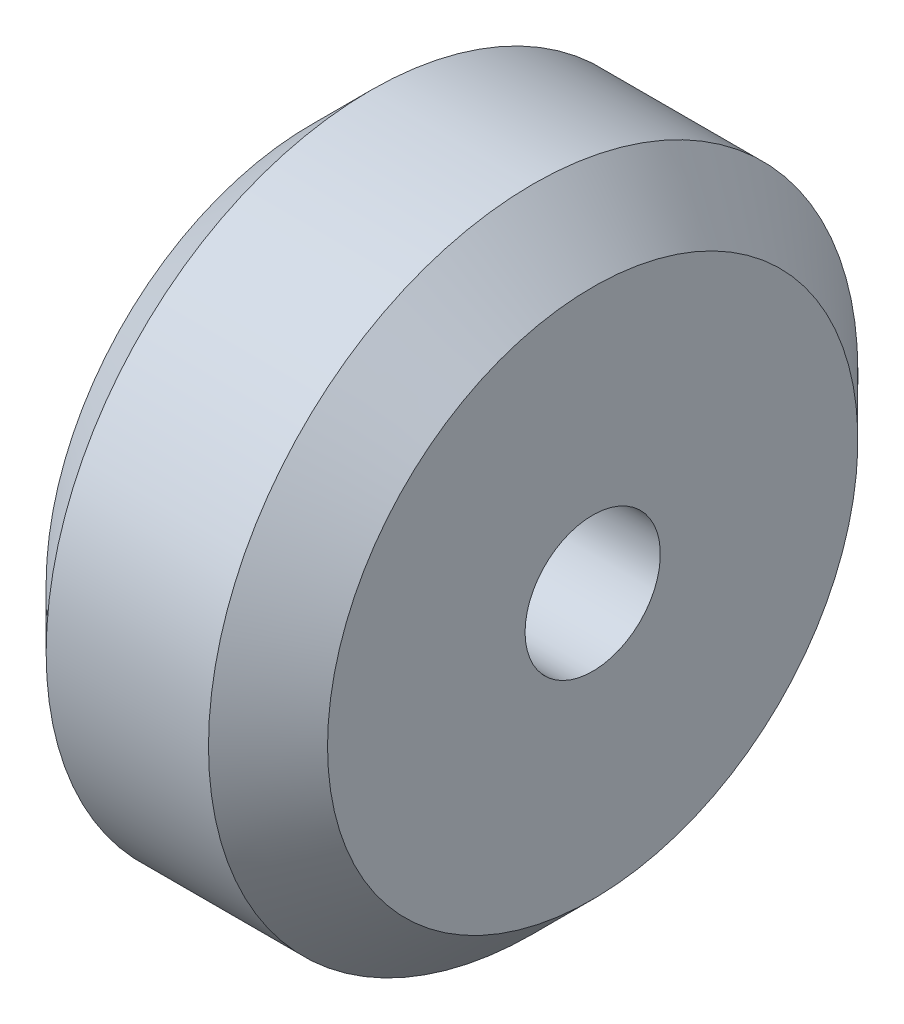
ISO-10303-21;
HEADER;
FILE_DESCRIPTION(('STEP AP214'),'2;1');
FILE_NAME('part.step','',(''),(''),'','','');
FILE_SCHEMA(('AUTOMOTIVE_DESIGN { 1 0 10303 214 1 1 1 1 }'));
ENDSEC;
DATA;
#1=APPLICATION_CONTEXT('core data for automotive mechanical design processes');
#2=APPLICATION_PROTOCOL_DEFINITION('international standard','automotive_design',2000,#1);
#3=PRODUCT_CONTEXT('',#1,'mechanical');
#4=PRODUCT('Part','Part','',(#3));
#5=PRODUCT_RELATED_PRODUCT_CATEGORY('part','',(#4));
#6=PRODUCT_DEFINITION_FORMATION('','',#4);
#7=PRODUCT_DEFINITION_CONTEXT('part definition',#1,'design');
#8=PRODUCT_DEFINITION('design','',#6,#7);
#9=PRODUCT_DEFINITION_SHAPE('','',#8);
#10=(LENGTH_UNIT() NAMED_UNIT(*) SI_UNIT(.MILLI.,.METRE.));
#11=(NAMED_UNIT(*) PLANE_ANGLE_UNIT() SI_UNIT($,.RADIAN.));
#12=(NAMED_UNIT(*) SI_UNIT($,.STERADIAN.) SOLID_ANGLE_UNIT());
#13=UNCERTAINTY_MEASURE_WITH_UNIT(LENGTH_MEASURE(1.E-05),#10,'distance_accuracy_value','');
#14=(GEOMETRIC_REPRESENTATION_CONTEXT(3) GLOBAL_UNCERTAINTY_ASSIGNED_CONTEXT((#13)) GLOBAL_UNIT_ASSIGNED_CONTEXT((#10,
#11,#12)) REPRESENTATION_CONTEXT('',''));
#15=CARTESIAN_POINT('',(0.,0.,0.));
#16=DIRECTION('',(0.,0.,1.));
#17=DIRECTION('',(1.,0.,0.));
#18=AXIS2_PLACEMENT_3D('',#15,#16,#17);
#19=CARTESIAN_POINT('',(-5.2,0.,0.));
#20=DIRECTION('',(-1.,0.,0.));
#21=DIRECTION('',(0.,0.,1.));
#22=AXIS2_PLACEMENT_3D('',#19,#20,#21);
#23=CYLINDRICAL_SURFACE('',#22,2.5);
#24=CARTESIAN_POINT('',(5.2,0.,0.));
#25=DIRECTION('',(-1.,0.,0.));
#26=DIRECTION('',(0.,0.,1.));
#27=AXIS2_PLACEMENT_3D('',#24,#25,#26);
#28=CIRCLE('',#27,2.5);
#29=CARTESIAN_POINT('',(5.2,0.,2.5));
#30=VERTEX_POINT('',#29);
#31=EDGE_CURVE('E10',#30,#30,#28,.T.);
#32=ORIENTED_EDGE('',*,*,#31,.F.);
#33=EDGE_LOOP('',(#32));
#34=FACE_BOUND('',#33,.T.);
#35=CARTESIAN_POINT('',(-5.2,0.,0.));
#36=DIRECTION('',(-1.,0.,0.));
#37=DIRECTION('',(0.,0.,1.));
#38=AXIS2_PLACEMENT_3D('',#35,#36,#37);
#39=CIRCLE('',#38,2.5);
#40=CARTESIAN_POINT('',(-5.2,0.,2.5));
#41=VERTEX_POINT('',#40);
#42=EDGE_CURVE('E52',#41,#41,#39,.T.);
#43=ORIENTED_EDGE('',*,*,#42,.T.);
#44=EDGE_LOOP('',(#43));
#45=FACE_BOUND('',#44,.T.);
#46=ADVANCED_FACE('F30',(#34,#45),#23,.F.);
#47=CARTESIAN_POINT('',(5.2,0.,0.));
#48=DIRECTION('',(-1.,0.,0.));
#49=DIRECTION('',(0.,0.,1.));
#50=AXIS2_PLACEMENT_3D('',#47,#48,#49);
#51=PLANE('',#50);
#52=CARTESIAN_POINT('',(5.2,0.,0.));
#53=DIRECTION('',(-1.,0.,0.));
#54=DIRECTION('',(0.,0.,1.));
#55=AXIS2_PLACEMENT_3D('',#52,#53,#54);
#56=CIRCLE('',#55,9.80000000000006);
#57=CARTESIAN_POINT('',(5.2,0.,9.80000000000006));
#58=VERTEX_POINT('',#57);
#59=EDGE_CURVE('E36',#58,#58,#56,.T.);
#60=ORIENTED_EDGE('',*,*,#59,.F.);
#61=EDGE_LOOP('',(#60));
#62=FACE_BOUND('',#61,.T.);
#63=ORIENTED_EDGE('',*,*,#31,.T.);
#64=EDGE_LOOP('',(#63));
#65=FACE_BOUND('',#64,.T.);
#66=ADVANCED_FACE('F69',(#62,#65),#51,.F.);
#67=CARTESIAN_POINT('',(3.,0.,0.));
#68=DIRECTION('',(-1.,0.,0.));
#69=DIRECTION('',(0.,0.,1.));
#70=AXIS2_PLACEMENT_3D('',#67,#68,#69);
#71=CONICAL_SURFACE('',#70,12.,0.785398163397436);
#72=ORIENTED_EDGE('',*,*,#59,.T.);
#73=EDGE_LOOP('',(#72));
#74=FACE_BOUND('',#73,.T.);
#75=CARTESIAN_POINT('',(3.,0.,0.));
#76=DIRECTION('',(-1.,0.,0.));
#77=DIRECTION('',(0.,0.,1.));
#78=AXIS2_PLACEMENT_3D('',#75,#76,#77);
#79=CIRCLE('',#78,12.);
#80=CARTESIAN_POINT('',(3.,0.,12.));
#81=VERTEX_POINT('',#80);
#82=EDGE_CURVE('E40',#81,#81,#79,.T.);
#83=ORIENTED_EDGE('',*,*,#82,.F.);
#84=EDGE_LOOP('',(#83));
#85=FACE_BOUND('',#84,.T.);
#86=ADVANCED_FACE('F74',(#74,#85),#71,.T.);
#87=CARTESIAN_POINT('',(-5.2,0.,0.));
#88=DIRECTION('',(-1.,0.,0.));
#89=DIRECTION('',(0.,0.,1.));
#90=AXIS2_PLACEMENT_3D('',#87,#88,#89);
#91=CYLINDRICAL_SURFACE('',#90,12.);
#92=ORIENTED_EDGE('',*,*,#82,.T.);
#93=EDGE_LOOP('',(#92));
#94=FACE_BOUND('',#93,.T.);
#95=CARTESIAN_POINT('',(-3.,0.,0.));
#96=DIRECTION('',(-1.,0.,0.));
#97=DIRECTION('',(0.,0.,1.));
#98=AXIS2_PLACEMENT_3D('',#95,#96,#97);
#99=CIRCLE('',#98,12.);
#100=CARTESIAN_POINT('',(-3.,0.,12.));
#101=VERTEX_POINT('',#100);
#102=EDGE_CURVE('E44',#101,#101,#99,.T.);
#103=ORIENTED_EDGE('',*,*,#102,.F.);
#104=EDGE_LOOP('',(#103));
#105=FACE_BOUND('',#104,.T.);
#106=ADVANCED_FACE('F65',(#94,#105),#91,.T.);
#107=CARTESIAN_POINT('',(-3.,0.,0.));
#108=DIRECTION('',(1.,0.,0.));
#109=DIRECTION('',(0.,0.,-1.));
#110=AXIS2_PLACEMENT_3D('',#107,#108,#109);
#111=CONICAL_SURFACE('',#110,12.,0.785398163397457);
#112=CARTESIAN_POINT('',(-5.2,0.,0.));
#113=DIRECTION('',(-1.,0.,0.));
#114=DIRECTION('',(0.,0.,1.));
#115=AXIS2_PLACEMENT_3D('',#112,#113,#114);
#116=CIRCLE('',#115,9.79999999999996);
#117=CARTESIAN_POINT('',(-5.2,0.,9.79999999999996));
#118=VERTEX_POINT('',#117);
#119=EDGE_CURVE('E49',#118,#118,#116,.T.);
#120=ORIENTED_EDGE('',*,*,#119,.F.);
#121=EDGE_LOOP('',(#120));
#122=FACE_BOUND('',#121,.T.);
#123=ORIENTED_EDGE('',*,*,#102,.T.);
#124=EDGE_LOOP('',(#123));
#125=FACE_BOUND('',#124,.T.);
#126=ADVANCED_FACE('F59',(#122,#125),#111,.T.);
#127=CARTESIAN_POINT('',(-5.2,0.,0.));
#128=DIRECTION('',(-1.,0.,0.));
#129=DIRECTION('',(0.,0.,1.));
#130=AXIS2_PLACEMENT_3D('',#127,#128,#129);
#131=PLANE('',#130);
#132=ORIENTED_EDGE('',*,*,#119,.T.);
#133=EDGE_LOOP('',(#132));
#134=FACE_BOUND('',#133,.T.);
#135=ORIENTED_EDGE('',*,*,#42,.F.);
#136=EDGE_LOOP('',(#135));
#137=FACE_BOUND('',#136,.T.);
#138=ADVANCED_FACE('F57',(#134,#137),#131,.T.);
#139=CLOSED_SHELL('',(#46,#66,#86,#106,#126,#138));
#140=MANIFOLD_SOLID_BREP('B2',#139);
#141=ADVANCED_BREP_SHAPE_REPRESENTATION('',(#18,#140),#14);
#142=SHAPE_DEFINITION_REPRESENTATION(#9,#141);
ENDSEC;
END-ISO-10303-21;
